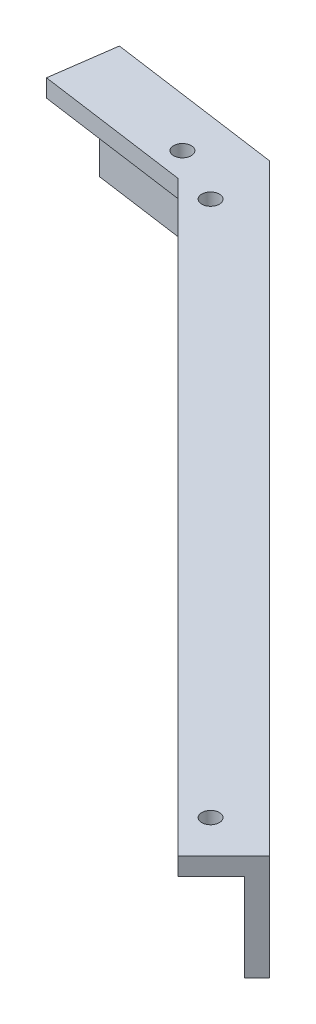
ISO-10303-21;
HEADER;
FILE_DESCRIPTION(('STEP AP214'),'2;1');
FILE_NAME('part.step','',(''),(''),'','','');
FILE_SCHEMA(('AUTOMOTIVE_DESIGN { 1 0 10303 214 1 1 1 1 }'));
ENDSEC;
DATA;
#1=APPLICATION_CONTEXT('core data for automotive mechanical design processes');
#2=APPLICATION_PROTOCOL_DEFINITION('international standard','automotive_design',2000,#1);
#3=PRODUCT_CONTEXT('',#1,'mechanical');
#4=PRODUCT('Part','Part','',(#3));
#5=PRODUCT_RELATED_PRODUCT_CATEGORY('part','',(#4));
#6=PRODUCT_DEFINITION_FORMATION('','',#4);
#7=PRODUCT_DEFINITION_CONTEXT('part definition',#1,'design');
#8=PRODUCT_DEFINITION('design','',#6,#7);
#9=PRODUCT_DEFINITION_SHAPE('','',#8);
#10=(LENGTH_UNIT() NAMED_UNIT(*) SI_UNIT(.MILLI.,.METRE.));
#11=(NAMED_UNIT(*) PLANE_ANGLE_UNIT() SI_UNIT($,.RADIAN.));
#12=(NAMED_UNIT(*) SI_UNIT($,.STERADIAN.) SOLID_ANGLE_UNIT());
#13=UNCERTAINTY_MEASURE_WITH_UNIT(LENGTH_MEASURE(1.E-05),#10,'distance_accuracy_value','');
#14=(GEOMETRIC_REPRESENTATION_CONTEXT(3) GLOBAL_UNCERTAINTY_ASSIGNED_CONTEXT((#13)) GLOBAL_UNIT_ASSIGNED_CONTEXT((#10,
#11,#12)) REPRESENTATION_CONTEXT('',''));
#15=CARTESIAN_POINT('',(0.,0.,0.));
#16=DIRECTION('',(0.,0.,1.));
#17=DIRECTION('',(1.,0.,0.));
#18=AXIS2_PLACEMENT_3D('',#15,#16,#17);
#19=CARTESIAN_POINT('',(60.4436508138957,0.,11.));
#20=DIRECTION('',(-0.707106781186547,0.,0.707106781186548));
#21=DIRECTION('',(0.707106781186548,0.,0.707106781186547));
#22=AXIS2_PLACEMENT_3D('',#19,#20,#21);
#23=PLANE('',#22);
#24=DIRECTION('',(0.707106781186548,0.,0.707106781186547));
#25=VECTOR('',#24,1.);
#26=CARTESIAN_POINT('',(60.4436508138957,3.,11.));
#27=LINE('',#26,#25);
#28=CARTESIAN_POINT('',(59.8286748561863,3.,10.3850240422906));
#29=VERTEX_POINT('',#28);
#30=CARTESIAN_POINT('',(159.752308678997,3.,110.308657865102));
#31=VERTEX_POINT('',#30);
#32=EDGE_CURVE('E197',#29,#31,#27,.T.);
#33=ORIENTED_EDGE('',*,*,#32,.F.);
#34=DIRECTION('',(0.,-1.,0.));
#35=VECTOR('',#34,1.);
#36=CARTESIAN_POINT('',(59.8286748561863,6.,10.3850240422906));
#37=LINE('',#36,#35);
#38=CARTESIAN_POINT('',(59.8286748561863,0.,10.3850240422906));
#39=VERTEX_POINT('',#38);
#40=EDGE_CURVE('E173',#29,#39,#37,.T.);
#41=ORIENTED_EDGE('',*,*,#40,.T.);
#42=DIRECTION('',(0.707106781186548,0.,0.707106781186547));
#43=VECTOR('',#42,1.);
#44=CARTESIAN_POINT('',(60.4436508138957,0.,11.));
#45=LINE('',#44,#43);
#46=CARTESIAN_POINT('',(159.752308678997,0.,110.308657865102));
#47=VERTEX_POINT('',#46);
#48=EDGE_CURVE('E206',#39,#47,#45,.T.);
#49=ORIENTED_EDGE('',*,*,#48,.T.);
#50=DIRECTION('',(0.,1.,0.));
#51=VECTOR('',#50,1.);
#52=CARTESIAN_POINT('',(159.752308678997,0.,110.308657865102));
#53=LINE('',#52,#51);
#54=EDGE_CURVE('E208',#47,#31,#53,.T.);
#55=ORIENTED_EDGE('',*,*,#54,.T.);
#56=EDGE_LOOP('',(#33,#41,#49,#55));
#57=FACE_BOUND('',#56,.T.);
#58=ADVANCED_FACE('F52',(#57),#23,.T.);
#59=CARTESIAN_POINT('',(33.7677613438322,6.,6.74887164822224));
#60=DIRECTION('',(0.138186558052084,0.,-0.990406217253162));
#61=DIRECTION('',(-0.990406217253162,0.,-0.138186558052085));
#62=AXIS2_PLACEMENT_3D('',#59,#60,#61);
#63=PLANE('',#62);
#64=DIRECTION('',(0.990406217253162,0.,0.138186558052085));
#65=VECTOR('',#64,1.);
#66=CARTESIAN_POINT('',(33.7677613438322,3.,6.74887164822224));
#67=LINE('',#66,#65);
#68=CARTESIAN_POINT('',(33.7677613438322,3.,6.74887164822224));
#69=VERTEX_POINT('',#68);
#70=EDGE_CURVE('E165',#69,#29,#67,.T.);
#71=ORIENTED_EDGE('',*,*,#70,.F.);
#72=DIRECTION('',(0.,-1.,0.));
#73=VECTOR('',#72,1.);
#74=CARTESIAN_POINT('',(33.7677613438322,6.,6.74887164822224));
#75=LINE('',#74,#73);
#76=CARTESIAN_POINT('',(33.7677613438322,0.,6.74887164822224));
#77=VERTEX_POINT('',#76);
#78=EDGE_CURVE('E175',#69,#77,#75,.T.);
#79=ORIENTED_EDGE('',*,*,#78,.T.);
#80=DIRECTION('',(-0.990406217253162,0.,-0.138186558052084));
#81=VECTOR('',#80,1.);
#82=CARTESIAN_POINT('',(59.8286748561863,0.,10.3850240422906));
#83=LINE('',#82,#81);
#84=EDGE_CURVE('E170',#39,#77,#83,.T.);
#85=ORIENTED_EDGE('',*,*,#84,.F.);
#86=ORIENTED_EDGE('',*,*,#40,.F.);
#87=EDGE_LOOP('',(#71,#79,#85,#86));
#88=FACE_BOUND('',#87,.T.);
#89=ADVANCED_FACE('F261',(#88),#63,.F.);
#90=CARTESIAN_POINT('',(35.2878134824051,6.,-4.14559674156254));
#91=DIRECTION('',(0.990406217253162,0.,0.138186558052085));
#92=DIRECTION('',(0.138186558052085,0.,-0.990406217253162));
#93=AXIS2_PLACEMENT_3D('',#90,#91,#92);
#94=PLANE('',#93);
#95=DIRECTION('',(-0.138186558052085,0.,0.990406217253162));
#96=VECTOR('',#95,1.);
#97=CARTESIAN_POINT('',(35.2878134824051,3.,-4.14559674156254));
#98=LINE('',#97,#96);
#99=CARTESIAN_POINT('',(35.2878134824051,3.,-4.14559674156254));
#100=VERTEX_POINT('',#99);
#101=EDGE_CURVE('E163',#100,#69,#98,.T.);
#102=ORIENTED_EDGE('',*,*,#101,.F.);
#103=DIRECTION('',(0.,-1.,0.));
#104=VECTOR('',#103,1.);
#105=CARTESIAN_POINT('',(35.2878134824051,6.,-4.14559674156254));
#106=LINE('',#105,#104);
#107=CARTESIAN_POINT('',(35.2878134824051,-15.,-4.14559674156254));
#108=VERTEX_POINT('',#107);
#109=EDGE_CURVE('E178',#100,#108,#106,.T.);
#110=ORIENTED_EDGE('',*,*,#109,.T.);
#111=DIRECTION('',(0.138186558052085,0.,-0.990406217253162));
#112=VECTOR('',#111,1.);
#113=CARTESIAN_POINT('',(34.0466043686968,-15.,4.75035696375144));
#114=LINE('',#113,#112);
#115=CARTESIAN_POINT('',(34.8732538082489,-15.,-1.17437808980306));
#116=VERTEX_POINT('',#115);
#117=EDGE_CURVE('E150',#116,#108,#114,.T.);
#118=ORIENTED_EDGE('',*,*,#117,.F.);
#119=DIRECTION('',(0.,1.,0.));
#120=VECTOR('',#119,1.);
#121=CARTESIAN_POINT('',(34.8732538082489,-15.,-1.17437808980306));
#122=LINE('',#121,#120);
#123=CARTESIAN_POINT('',(34.8732538082489,0.,-1.17437808980306));
#124=VERTEX_POINT('',#123);
#125=EDGE_CURVE('E146',#116,#124,#122,.T.);
#126=ORIENTED_EDGE('',*,*,#125,.T.);
#127=DIRECTION('',(-0.138186558052085,0.,0.990406217253162));
#128=VECTOR('',#127,1.);
#129=CARTESIAN_POINT('',(35.2878134824051,0.,-4.14559674156254));
#130=LINE('',#129,#128);
#131=EDGE_CURVE('E168',#124,#77,#130,.T.);
#132=ORIENTED_EDGE('',*,*,#131,.T.);
#133=ORIENTED_EDGE('',*,*,#78,.F.);
#134=EDGE_LOOP('',(#102,#110,#118,#126,#132,#133));
#135=FACE_BOUND('',#134,.T.);
#136=ADVANCED_FACE('F239',(#135),#94,.F.);
#137=CARTESIAN_POINT('',(65.,6.,0.));
#138=DIRECTION('',(-0.138186558052085,0.,0.990406217253162));
#139=DIRECTION('',(0.990406217253162,0.,0.138186558052085));
#140=AXIS2_PLACEMENT_3D('',#137,#138,#139);
#141=PLANE('',#140);
#142=CARTESIAN_POINT('',(57.0767502619747,-4.1,-1.10549246441668));
#143=DIRECTION('',(0.138186558052085,0.,-0.990406217253162));
#144=DIRECTION('',(-0.990406217253162,0.,-0.138186558052085));
#145=AXIS2_PLACEMENT_3D('',#142,#143,#144);
#146=CIRCLE('',#145,1.50000000000001);
#147=CARTESIAN_POINT('',(55.591140936095,-4.1,-1.31277230149481));
#148=VERTEX_POINT('',#147);
#149=EDGE_CURVE('E227',#148,#148,#146,.T.);
#150=ORIENTED_EDGE('',*,*,#149,.F.);
#151=EDGE_LOOP('',(#150));
#152=FACE_BOUND('',#151,.T.);
#153=DIRECTION('',(-0.990406217253162,0.,-0.138186558052085));
#154=VECTOR('',#153,1.);
#155=CARTESIAN_POINT('',(65.,3.,0.));
#156=LINE('',#155,#154);
#157=CARTESIAN_POINT('',(65.,3.,0.));
#158=VERTEX_POINT('',#157);
#159=EDGE_CURVE('E145',#158,#100,#156,.T.);
#160=ORIENTED_EDGE('',*,*,#159,.F.);
#161=DIRECTION('',(0.,-1.,0.));
#162=VECTOR('',#161,1.);
#163=CARTESIAN_POINT('',(65.,3.,0.));
#164=LINE('',#163,#162);
#165=CARTESIAN_POINT('',(65.,-15.,0.));
#166=VERTEX_POINT('',#165);
#167=EDGE_CURVE('E61',#158,#166,#164,.T.);
#168=ORIENTED_EDGE('',*,*,#167,.T.);
#169=DIRECTION('',(0.990406217253162,0.,0.138186558052085));
#170=VECTOR('',#169,1.);
#171=CARTESIAN_POINT('',(1.24120911370834,-15.,-8.89595370531399));
#172=LINE('',#171,#170);
#173=EDGE_CURVE('E153',#108,#166,#172,.T.);
#174=ORIENTED_EDGE('',*,*,#173,.F.);
#175=ORIENTED_EDGE('',*,*,#109,.F.);
#176=EDGE_LOOP('',(#160,#168,#174,#175));
#177=FACE_BOUND('',#176,.T.);
#178=ADVANCED_FACE('F235',(#152,#177),#141,.F.);
#179=CARTESIAN_POINT('',(0.,3.,0.));
#180=DIRECTION('',(0.,-1.,0.));
#181=DIRECTION('',(0.,0.,-1.));
#182=AXIS2_PLACEMENT_3D('',#179,#180,#181);
#183=PLANE('',#182);
#184=CARTESIAN_POINT('',(56.0956256998049,3.,5.92639167808077));
#185=DIRECTION('',(0.,-1.,0.));
#186=DIRECTION('',(0.,0.,-1.));
#187=AXIS2_PLACEMENT_3D('',#184,#185,#186);
#188=CIRCLE('',#187,1.5);
#189=CARTESIAN_POINT('',(56.0956256998049,3.,4.42639167808077));
#190=VERTEX_POINT('',#189);
#191=EDGE_CURVE('E155',#190,#190,#188,.T.);
#192=ORIENTED_EDGE('',*,*,#191,.T.);
#193=EDGE_LOOP('',(#192));
#194=FACE_BOUND('',#193,.T.);
#195=CARTESIAN_POINT('',(156.853170876133,3.,101.894087168981));
#196=DIRECTION('',(0.,1.,0.));
#197=DIRECTION('',(0.,0.,1.));
#198=AXIS2_PLACEMENT_3D('',#195,#196,#197);
#199=CIRCLE('',#198,1.50000000000002);
#200=CARTESIAN_POINT('',(156.853170876133,3.,103.394087168982));
#201=VERTEX_POINT('',#200);
#202=EDGE_CURVE('E193',#201,#201,#199,.T.);
#203=ORIENTED_EDGE('',*,*,#202,.F.);
#204=EDGE_LOOP('',(#203));
#205=FACE_BOUND('',#204,.T.);
#206=DIRECTION('',(-0.707106781186548,0.,-0.707106781186547));
#207=VECTOR('',#206,1.);
#208=CARTESIAN_POINT('',(65.,3.,0.));
#209=LINE('',#208,#207);
#210=CARTESIAN_POINT('',(167.530483272049,3.,102.530483272049));
#211=VERTEX_POINT('',#210);
#212=EDGE_CURVE('E214',#211,#158,#209,.T.);
#213=ORIENTED_EDGE('',*,*,#212,.T.);
#214=ORIENTED_EDGE('',*,*,#159,.T.);
#215=ORIENTED_EDGE('',*,*,#101,.T.);
#216=ORIENTED_EDGE('',*,*,#70,.T.);
#217=ORIENTED_EDGE('',*,*,#32,.T.);
#218=DIRECTION('',(0.707106781186548,0.,-0.707106781186547));
#219=VECTOR('',#218,1.);
#220=CARTESIAN_POINT('',(167.530483272049,3.,102.530483272049));
#221=LINE('',#220,#219);
#222=EDGE_CURVE('E77',#31,#211,#221,.T.);
#223=ORIENTED_EDGE('',*,*,#222,.T.);
#224=EDGE_LOOP('',(#213,#214,#215,#216,#217,#223));
#225=FACE_BOUND('',#224,.T.);
#226=CARTESIAN_POINT('',(65.6363961030679,3.,10.6773123959169));
#227=DIRECTION('',(0.,1.,0.));
#228=DIRECTION('',(0.,0.,1.));
#229=AXIS2_PLACEMENT_3D('',#226,#227,#228);
#230=CIRCLE('',#229,1.5);
#231=CARTESIAN_POINT('',(65.6363961030679,3.,12.1773123959168));
#232=VERTEX_POINT('',#231);
#233=EDGE_CURVE('E198',#232,#232,#230,.T.);
#234=ORIENTED_EDGE('',*,*,#233,.F.);
#235=EDGE_LOOP('',(#234));
#236=FACE_BOUND('',#235,.T.);
#237=ADVANCED_FACE('F238',(#194,#205,#225,#236),#183,.F.);
#238=CARTESIAN_POINT('',(0.,0.,0.));
#239=DIRECTION('',(0.,-1.,0.));
#240=DIRECTION('',(0.,0.,-1.));
#241=AXIS2_PLACEMENT_3D('',#238,#239,#240);
#242=PLANE('',#241);
#243=CARTESIAN_POINT('',(56.0956256998049,0.,5.92639167808077));
#244=DIRECTION('',(0.,-1.,0.));
#245=DIRECTION('',(0.,0.,-1.));
#246=AXIS2_PLACEMENT_3D('',#243,#244,#245);
#247=CIRCLE('',#246,1.5);
#248=CARTESIAN_POINT('',(56.0956256998049,0.,4.42639167808077));
#249=VERTEX_POINT('',#248);
#250=EDGE_CURVE('E221',#249,#249,#247,.T.);
#251=ORIENTED_EDGE('',*,*,#250,.F.);
#252=EDGE_LOOP('',(#251));
#253=FACE_BOUND('',#252,.T.);
#254=DIRECTION('',(0.990406217253162,0.,0.138186558052085));
#255=VECTOR('',#254,1.);
#256=CARTESIAN_POINT('',(0.826649439552089,0.,-5.9247350535545));
#257=LINE('',#256,#255);
#258=CARTESIAN_POINT('',(63.5896385971419,0.,2.8322792842611));
#259=VERTEX_POINT('',#258);
#260=EDGE_CURVE('E151',#124,#259,#257,.T.);
#261=ORIENTED_EDGE('',*,*,#260,.T.);
#262=DIRECTION('',(-0.707106781186547,0.,-0.707106781186548));
#263=VECTOR('',#262,1.);
#264=CARTESIAN_POINT('',(63.7573593128808,0.,3.));
#265=LINE('',#264,#263);
#266=CARTESIAN_POINT('',(165.40916292849,0.,104.651803615609));
#267=VERTEX_POINT('',#266);
#268=EDGE_CURVE('E69',#267,#259,#265,.T.);
#269=ORIENTED_EDGE('',*,*,#268,.F.);
#270=DIRECTION('',(0.707106781186548,0.,-0.707106781186547));
#271=VECTOR('',#270,1.);
#272=CARTESIAN_POINT('',(167.530483272049,0.,102.530483272049));
#273=LINE('',#272,#271);
#274=EDGE_CURVE('E212',#47,#267,#273,.T.);
#275=ORIENTED_EDGE('',*,*,#274,.F.);
#276=ORIENTED_EDGE('',*,*,#48,.F.);
#277=ORIENTED_EDGE('',*,*,#84,.T.);
#278=ORIENTED_EDGE('',*,*,#131,.F.);
#279=EDGE_LOOP('',(#261,#269,#275,#276,#277,#278));
#280=FACE_BOUND('',#279,.T.);
#281=CARTESIAN_POINT('',(65.6363961030679,0.,10.6773123959169));
#282=DIRECTION('',(0.,1.,0.));
#283=DIRECTION('',(0.,0.,1.));
#284=AXIS2_PLACEMENT_3D('',#281,#282,#283);
#285=CIRCLE('',#284,1.5);
#286=CARTESIAN_POINT('',(65.6363961030679,0.,12.1773123959168));
#287=VERTEX_POINT('',#286);
#288=EDGE_CURVE('E194',#287,#287,#285,.T.);
#289=ORIENTED_EDGE('',*,*,#288,.T.);
#290=EDGE_LOOP('',(#289));
#291=FACE_BOUND('',#290,.T.);
#292=CARTESIAN_POINT('',(156.853170876133,0.,101.894087168981));
#293=DIRECTION('',(0.,1.,0.));
#294=DIRECTION('',(0.,0.,1.));
#295=AXIS2_PLACEMENT_3D('',#292,#293,#294);
#296=CIRCLE('',#295,1.50000000000002);
#297=CARTESIAN_POINT('',(156.853170876133,0.,103.394087168982));
#298=VERTEX_POINT('',#297);
#299=EDGE_CURVE('E201',#298,#298,#296,.T.);
#300=ORIENTED_EDGE('',*,*,#299,.T.);
#301=EDGE_LOOP('',(#300));
#302=FACE_BOUND('',#301,.T.);
#303=ADVANCED_FACE('F253',(#253,#280,#291,#302),#242,.T.);
#304=CARTESIAN_POINT('',(167.530483272049,3.,102.530483272049));
#305=DIRECTION('',(-0.707106781186547,0.,-0.707106781186548));
#306=DIRECTION('',(-0.707106781186548,0.,0.707106781186547));
#307=AXIS2_PLACEMENT_3D('',#304,#305,#306);
#308=PLANE('',#307);
#309=ORIENTED_EDGE('',*,*,#274,.T.);
#310=DIRECTION('',(0.,1.,0.));
#311=VECTOR('',#310,1.);
#312=CARTESIAN_POINT('',(165.40916292849,-15.,104.651803615609));
#313=LINE('',#312,#311);
#314=CARTESIAN_POINT('',(165.40916292849,-15.,104.651803615609));
#315=VERTEX_POINT('',#314);
#316=EDGE_CURVE('E138',#315,#267,#313,.T.);
#317=ORIENTED_EDGE('',*,*,#316,.F.);
#318=DIRECTION('',(-0.707106781186545,0.,0.70710678118655));
#319=VECTOR('',#318,1.);
#320=CARTESIAN_POINT('',(165.40916292849,-15.,104.651803615609));
#321=LINE('',#320,#319);
#322=CARTESIAN_POINT('',(167.530483272049,-15.,102.530483272049));
#323=VERTEX_POINT('',#322);
#324=EDGE_CURVE('E134',#323,#315,#321,.T.);
#325=ORIENTED_EDGE('',*,*,#324,.F.);
#326=DIRECTION('',(0.,-1.,0.));
#327=VECTOR('',#326,1.);
#328=CARTESIAN_POINT('',(167.530483272049,3.,102.530483272049));
#329=LINE('',#328,#327);
#330=EDGE_CURVE('E13',#211,#323,#329,.T.);
#331=ORIENTED_EDGE('',*,*,#330,.F.);
#332=ORIENTED_EDGE('',*,*,#222,.F.);
#333=ORIENTED_EDGE('',*,*,#54,.F.);
#334=EDGE_LOOP('',(#309,#317,#325,#331,#332,#333));
#335=FACE_BOUND('',#334,.T.);
#336=ADVANCED_FACE('F54',(#335),#308,.F.);
#337=CARTESIAN_POINT('',(65.,3.,0.));
#338=DIRECTION('',(-0.707106781186547,0.,0.707106781186548));
#339=DIRECTION('',(0.707106781186548,0.,0.707106781186547));
#340=AXIS2_PLACEMENT_3D('',#337,#338,#339);
#341=PLANE('',#340);
#342=CARTESIAN_POINT('',(161.873629022557,-7.5,96.873629022557));
#343=DIRECTION('',(0.707106781186548,0.,-0.707106781186548));
#344=DIRECTION('',(-0.707106781186548,0.,-0.707106781186548));
#345=AXIS2_PLACEMENT_3D('',#342,#343,#344);
#346=CIRCLE('',#345,1.50000000000003);
#347=CARTESIAN_POINT('',(160.812968850777,-7.5,95.8129688507771));
#348=VERTEX_POINT('',#347);
#349=EDGE_CURVE('E181',#348,#348,#346,.T.);
#350=ORIENTED_EDGE('',*,*,#349,.F.);
#351=EDGE_LOOP('',(#350));
#352=FACE_BOUND('',#351,.T.);
#353=CARTESIAN_POINT('',(70.6568542494924,-7.5,5.65685424949237));
#354=DIRECTION('',(0.707106781186548,0.,-0.707106781186548));
#355=DIRECTION('',(-0.707106781186548,0.,-0.707106781186548));
#356=AXIS2_PLACEMENT_3D('',#353,#354,#355);
#357=CIRCLE('',#356,1.5);
#358=CARTESIAN_POINT('',(69.5961940777126,-7.5,4.59619407771254));
#359=VERTEX_POINT('',#358);
#360=EDGE_CURVE('E180',#359,#359,#357,.T.);
#361=ORIENTED_EDGE('',*,*,#360,.F.);
#362=EDGE_LOOP('',(#361));
#363=FACE_BOUND('',#362,.T.);
#364=ORIENTED_EDGE('',*,*,#330,.T.);
#365=DIRECTION('',(0.707106781186548,0.,0.707106781186547));
#366=VECTOR('',#365,1.);
#367=CARTESIAN_POINT('',(167.530483272049,-15.,102.530483272049));
#368=LINE('',#367,#366);
#369=EDGE_CURVE('E187',#166,#323,#368,.T.);
#370=ORIENTED_EDGE('',*,*,#369,.F.);
#371=ORIENTED_EDGE('',*,*,#167,.F.);
#372=ORIENTED_EDGE('',*,*,#212,.F.);
#373=EDGE_LOOP('',(#364,#370,#371,#372));
#374=FACE_BOUND('',#373,.T.);
#375=ADVANCED_FACE('F249',(#352,#363,#374),#341,.F.);
#376=CARTESIAN_POINT('',(156.853170876133,0.,101.894087168981));
#377=DIRECTION('',(0.,1.,0.));
#378=DIRECTION('',(0.,0.,1.));
#379=AXIS2_PLACEMENT_3D('',#376,#377,#378);
#380=CYLINDRICAL_SURFACE('',#379,1.50000000000002);
#381=ORIENTED_EDGE('',*,*,#299,.F.);
#382=EDGE_LOOP('',(#381));
#383=FACE_BOUND('',#382,.T.);
#384=ORIENTED_EDGE('',*,*,#202,.T.);
#385=EDGE_LOOP('',(#384));
#386=FACE_BOUND('',#385,.T.);
#387=ADVANCED_FACE('F274',(#383,#386),#380,.F.);
#388=CARTESIAN_POINT('',(65.6363961030679,0.,10.6773123959169));
#389=DIRECTION('',(0.,1.,0.));
#390=DIRECTION('',(0.,0.,1.));
#391=AXIS2_PLACEMENT_3D('',#388,#389,#390);
#392=CYLINDRICAL_SURFACE('',#391,1.5);
#393=ORIENTED_EDGE('',*,*,#288,.F.);
#394=EDGE_LOOP('',(#393));
#395=FACE_BOUND('',#394,.T.);
#396=ORIENTED_EDGE('',*,*,#233,.T.);
#397=EDGE_LOOP('',(#396));
#398=FACE_BOUND('',#397,.T.);
#399=ADVANCED_FACE('F288',(#395,#398),#392,.F.);
#400=CARTESIAN_POINT('',(63.7573593128808,-15.,3.));
#401=DIRECTION('',(0.707106781186548,0.,-0.707106781186547));
#402=DIRECTION('',(-0.707106781186547,0.,-0.707106781186548));
#403=AXIS2_PLACEMENT_3D('',#400,#401,#402);
#404=PLANE('',#403);
#405=CARTESIAN_POINT('',(159.752308678997,-7.5,98.9949493661166));
#406=DIRECTION('',(0.707106781186548,0.,-0.707106781186547));
#407=DIRECTION('',(-0.707106781186547,0.,-0.707106781186548));
#408=AXIS2_PLACEMENT_3D('',#405,#406,#407);
#409=CIRCLE('',#408,1.50000000000003);
#410=CARTESIAN_POINT('',(158.691648507218,-7.5,97.9342891943368));
#411=VERTEX_POINT('',#410);
#412=EDGE_CURVE('E191',#411,#411,#409,.T.);
#413=ORIENTED_EDGE('',*,*,#412,.T.);
#414=EDGE_LOOP('',(#413));
#415=FACE_BOUND('',#414,.T.);
#416=CARTESIAN_POINT('',(68.5355339059328,-7.5,7.77817459305199));
#417=DIRECTION('',(0.707106781186548,0.,-0.707106781186547));
#418=DIRECTION('',(-0.707106781186547,0.,-0.707106781186548));
#419=AXIS2_PLACEMENT_3D('',#416,#417,#418);
#420=CIRCLE('',#419,1.5);
#421=CARTESIAN_POINT('',(67.474873734153,-7.5,6.71751442127216));
#422=VERTEX_POINT('',#421);
#423=EDGE_CURVE('E184',#422,#422,#420,.T.);
#424=ORIENTED_EDGE('',*,*,#423,.T.);
#425=EDGE_LOOP('',(#424));
#426=FACE_BOUND('',#425,.T.);
#427=ORIENTED_EDGE('',*,*,#268,.T.);
#428=DIRECTION('',(0.,1.,0.));
#429=VECTOR('',#428,1.);
#430=CARTESIAN_POINT('',(63.5896385971419,-15.,2.8322792842611));
#431=LINE('',#430,#429);
#432=CARTESIAN_POINT('',(63.5896385971419,-15.,2.8322792842611));
#433=VERTEX_POINT('',#432);
#434=EDGE_CURVE('E141',#433,#259,#431,.T.);
#435=ORIENTED_EDGE('',*,*,#434,.F.);
#436=DIRECTION('',(-0.707106781186547,0.,-0.707106781186548));
#437=VECTOR('',#436,1.);
#438=CARTESIAN_POINT('',(63.7573593128808,-15.,3.));
#439=LINE('',#438,#437);
#440=EDGE_CURVE('E125',#315,#433,#439,.T.);
#441=ORIENTED_EDGE('',*,*,#440,.F.);
#442=ORIENTED_EDGE('',*,*,#316,.T.);
#443=EDGE_LOOP('',(#427,#435,#441,#442));
#444=FACE_BOUND('',#443,.T.);
#445=ADVANCED_FACE('F142',(#415,#426,#444),#404,.F.);
#446=CARTESIAN_POINT('',(0.,-15.,0.));
#447=DIRECTION('',(0.,1.,0.));
#448=DIRECTION('',(0.,0.,1.));
#449=AXIS2_PLACEMENT_3D('',#446,#447,#448);
#450=PLANE('',#449);
#451=ORIENTED_EDGE('',*,*,#173,.T.);
#452=ORIENTED_EDGE('',*,*,#369,.T.);
#453=ORIENTED_EDGE('',*,*,#324,.T.);
#454=ORIENTED_EDGE('',*,*,#440,.T.);
#455=DIRECTION('',(0.990406217253162,0.,0.138186558052085));
#456=VECTOR('',#455,1.);
#457=CARTESIAN_POINT('',(0.826649439552089,-15.,-5.9247350535545));
#458=LINE('',#457,#456);
#459=EDGE_CURVE('E131',#116,#433,#458,.T.);
#460=ORIENTED_EDGE('',*,*,#459,.F.);
#461=ORIENTED_EDGE('',*,*,#117,.T.);
#462=EDGE_LOOP('',(#451,#452,#453,#454,#460,#461));
#463=FACE_BOUND('',#462,.T.);
#464=ADVANCED_FACE('F128',(#463),#450,.F.);
#465=CARTESIAN_POINT('',(60.0502525316942,-7.5,16.2634559672906));
#466=DIRECTION('',(0.707106781186547,0.,-0.707106781186547));
#467=DIRECTION('',(-0.707106781186548,0.,-0.707106781186548));
#468=AXIS2_PLACEMENT_3D('',#465,#466,#467);
#469=CYLINDRICAL_SURFACE('',#468,1.5);
#470=ORIENTED_EDGE('',*,*,#360,.T.);
#471=EDGE_LOOP('',(#470));
#472=FACE_BOUND('',#471,.T.);
#473=ORIENTED_EDGE('',*,*,#423,.F.);
#474=EDGE_LOOP('',(#473));
#475=FACE_BOUND('',#474,.T.);
#476=ADVANCED_FACE('F295',(#472,#475),#469,.F.);
#477=CARTESIAN_POINT('',(151.267027304759,-7.5,107.480230740355));
#478=DIRECTION('',(0.707106781186547,0.,-0.707106781186547));
#479=DIRECTION('',(-0.707106781186548,0.,-0.707106781186548));
#480=AXIS2_PLACEMENT_3D('',#477,#478,#479);
#481=CYLINDRICAL_SURFACE('',#480,1.50000000000003);
#482=ORIENTED_EDGE('',*,*,#349,.T.);
#483=EDGE_LOOP('',(#482));
#484=FACE_BOUND('',#483,.T.);
#485=ORIENTED_EDGE('',*,*,#412,.F.);
#486=EDGE_LOOP('',(#485));
#487=FACE_BOUND('',#486,.T.);
#488=ADVANCED_FACE('F298',(#484,#487),#481,.F.);
#489=CARTESIAN_POINT('',(0.826649439552089,-15.,-5.9247350535545));
#490=DIRECTION('',(-0.138186558052085,0.,0.990406217253162));
#491=DIRECTION('',(0.990406217253162,0.,0.138186558052085));
#492=AXIS2_PLACEMENT_3D('',#489,#490,#491);
#493=PLANE('',#492);
#494=CARTESIAN_POINT('',(56.6621905878185,-4.1,1.86572618734281));
#495=DIRECTION('',(-0.138186558052085,0.,0.990406217253162));
#496=DIRECTION('',(0.990406217253162,0.,0.138186558052085));
#497=AXIS2_PLACEMENT_3D('',#494,#495,#496);
#498=CIRCLE('',#497,1.50000000000001);
#499=CARTESIAN_POINT('',(58.1477999136982,-4.1,2.07300602442094));
#500=VERTEX_POINT('',#499);
#501=EDGE_CURVE('E56',#500,#500,#498,.T.);
#502=ORIENTED_EDGE('',*,*,#501,.F.);
#503=EDGE_LOOP('',(#502));
#504=FACE_BOUND('',#503,.T.);
#505=ORIENTED_EDGE('',*,*,#260,.F.);
#506=ORIENTED_EDGE('',*,*,#125,.F.);
#507=ORIENTED_EDGE('',*,*,#459,.T.);
#508=ORIENTED_EDGE('',*,*,#434,.T.);
#509=EDGE_LOOP('',(#505,#506,#507,#508));
#510=FACE_BOUND('',#509,.T.);
#511=ADVANCED_FACE('F148',(#504,#510),#493,.T.);
#512=CARTESIAN_POINT('',(56.0956256998049,15.,5.92639167808077));
#513=DIRECTION('',(0.,-1.,0.));
#514=DIRECTION('',(0.,0.,-1.));
#515=AXIS2_PLACEMENT_3D('',#512,#513,#514);
#516=CYLINDRICAL_SURFACE('',#515,1.5);
#517=CARTESIAN_POINT('',(56.0956256998049,0.,4.42639167808077));
#518=CARTESIAN_POINT('',(56.0956256998049,0.0312500000000018,4.42639167808077));
#519=CARTESIAN_POINT('',(56.0956256998049,0.0625000000000018,4.42639167808077));
#520=CARTESIAN_POINT('',(56.0956256998049,0.125000000000002,4.42639167808077));
#521=CARTESIAN_POINT('',(56.0956256998049,0.156250000000002,4.42639167808077));
#522=CARTESIAN_POINT('',(56.0956256998049,0.218750000000002,4.42639167808077));
#523=CARTESIAN_POINT('',(56.0956256998049,0.250000000000002,4.42639167808077));
#524=CARTESIAN_POINT('',(56.0956256998049,0.312500000000002,4.42639167808077));
#525=CARTESIAN_POINT('',(56.0956256998049,0.343750000000002,4.42639167808077));
#526=CARTESIAN_POINT('',(56.0956256998049,0.406250000000002,4.42639167808077));
#527=CARTESIAN_POINT('',(56.0956256998049,0.437500000000002,4.42639167808077));
#528=CARTESIAN_POINT('',(56.0956256998049,0.500000000000002,4.42639167808077));
#529=CARTESIAN_POINT('',(56.0956256998049,0.531250000000002,4.42639167808077));
#530=CARTESIAN_POINT('',(56.0956256998049,0.593750000000002,4.42639167808077));
#531=CARTESIAN_POINT('',(56.0956256998049,0.625000000000002,4.42639167808077));
#532=CARTESIAN_POINT('',(56.0956256998049,0.687500000000002,4.42639167808077));
#533=CARTESIAN_POINT('',(56.0956256998049,0.718750000000002,4.42639167808077));
#534=CARTESIAN_POINT('',(56.0956256998049,0.781250000000002,4.42639167808077));
#535=CARTESIAN_POINT('',(56.0956256998049,0.812500000000001,4.42639167808077));
#536=CARTESIAN_POINT('',(56.0956256998049,0.875000000000001,4.42639167808077));
#537=CARTESIAN_POINT('',(56.0956256998049,0.906250000000001,4.42639167808077));
#538=CARTESIAN_POINT('',(56.0956256998049,0.968750000000001,4.42639167808077));
#539=CARTESIAN_POINT('',(56.0956256998049,1.,4.42639167808077));
#540=CARTESIAN_POINT('',(56.0956256998049,1.0625,4.42639167808077));
#541=CARTESIAN_POINT('',(56.0956256998049,1.09375,4.42639167808077));
#542=CARTESIAN_POINT('',(56.0956256998049,1.15625,4.42639167808077));
#543=CARTESIAN_POINT('',(56.0956256998049,1.1875,4.42639167808077));
#544=CARTESIAN_POINT('',(56.0956256998049,1.25,4.42639167808077));
#545=CARTESIAN_POINT('',(56.0956256998049,1.28125,4.42639167808077));
#546=CARTESIAN_POINT('',(56.0956256998049,1.34375,4.42639167808077));
#547=CARTESIAN_POINT('',(56.0956256998049,1.375,4.42639167808077));
#548=CARTESIAN_POINT('',(56.0956256998049,1.4375,4.42639167808077));
#549=CARTESIAN_POINT('',(56.0956256998049,1.46875,4.42639167808077));
#550=CARTESIAN_POINT('',(56.0956256998049,1.53125,4.42639167808077));
#551=CARTESIAN_POINT('',(56.0956256998049,1.5625,4.42639167808077));
#552=CARTESIAN_POINT('',(56.0956256998049,1.625,4.42639167808077));
#553=CARTESIAN_POINT('',(56.0956256998049,1.65625,4.42639167808077));
#554=CARTESIAN_POINT('',(56.0956256998049,1.71875,4.42639167808077));
#555=CARTESIAN_POINT('',(56.0956256998049,1.75,4.42639167808077));
#556=CARTESIAN_POINT('',(56.0956256998049,1.8125,4.42639167808077));
#557=CARTESIAN_POINT('',(56.0956256998049,1.84375,4.42639167808077));
#558=CARTESIAN_POINT('',(56.0956256998049,1.90625,4.42639167808077));
#559=CARTESIAN_POINT('',(56.0956256998049,1.9375,4.42639167808077));
#560=CARTESIAN_POINT('',(56.0956256998049,2.,4.42639167808077));
#561=CARTESIAN_POINT('',(56.0956256998049,2.03125,4.42639167808077));
#562=CARTESIAN_POINT('',(56.0956256998049,2.09375,4.42639167808077));
#563=CARTESIAN_POINT('',(56.0956256998049,2.125,4.42639167808077));
#564=CARTESIAN_POINT('',(56.0956256998049,2.1875,4.42639167808077));
#565=CARTESIAN_POINT('',(56.0956256998049,2.21875,4.42639167808077));
#566=CARTESIAN_POINT('',(56.0956256998049,2.28125,4.42639167808077));
#567=CARTESIAN_POINT('',(56.0956256998049,2.3125,4.42639167808077));
#568=CARTESIAN_POINT('',(56.0956256998049,2.375,4.42639167808077));
#569=CARTESIAN_POINT('',(56.0956256998049,2.40625,4.42639167808077));
#570=CARTESIAN_POINT('',(56.0956256998049,2.46875,4.42639167808077));
#571=CARTESIAN_POINT('',(56.0956256998049,2.5,4.42639167808077));
#572=CARTESIAN_POINT('',(56.0956256998049,2.5625,4.42639167808077));
#573=CARTESIAN_POINT('',(56.0956256998049,2.59375,4.42639167808077));
#574=CARTESIAN_POINT('',(56.0956256998049,2.65625,4.42639167808077));
#575=CARTESIAN_POINT('',(56.0956256998049,2.6875,4.42639167808077));
#576=CARTESIAN_POINT('',(56.0956256998049,2.75,4.42639167808077));
#577=CARTESIAN_POINT('',(56.0956256998049,2.78125,4.42639167808077));
#578=CARTESIAN_POINT('',(56.0956256998049,2.84375,4.42639167808077));
#579=CARTESIAN_POINT('',(56.0956256998049,2.875,4.42639167808077));
#580=CARTESIAN_POINT('',(56.0956256998049,2.9375,4.42639167808077));
#581=CARTESIAN_POINT('',(56.0956256998049,2.96875,4.42639167808077));
#582=CARTESIAN_POINT('',(56.0956256998049,3.,4.42639167808077));
#583=B_SPLINE_CURVE_WITH_KNOTS('',3,(#517,#518,#519,#520,#521,#522,#523,#524,#525,#526,#527,
#528,#529,#530,#531,#532,#533,#534,#535,#536,#537,#538,#539,#540,#541,#542,#543,#544,#545,#546,
#547,#548,#549,#550,#551,#552,#553,#554,#555,#556,#557,#558,#559,#560,#561,#562,#563,#564,#565,
#566,#567,#568,#569,#570,#571,#572,#573,#574,#575,#576,#577,#578,#579,#580,#581,#582),
.UNSPECIFIED.,.F.,.F.,(4,2,2,2,2,2,2,2,2,2,2,2,2,2,2,2,2,2,2,2,2,2,2,2,2,2,2,2,2,2,2,2,4),(0.,
0.0937500000000001,0.1875,0.28125,0.375,0.46875,0.5625,0.656250000000001,0.750000000000001,
0.843749999999999,0.937499999999999,1.03125,1.125,1.21875,1.3125,1.40625,1.5,1.59375,1.6875,
1.78125,1.875,1.96875,2.0625,2.15625,2.25,2.34375,2.4375,2.53125,2.625,2.71875,2.8125,2.90625,
3.),.UNSPECIFIED.);
#584=EDGE_CURVE('BSEAM317',#249,#190,#583,.T.);
#585=ORIENTED_EDGE('',*,*,#250,.T.);
#586=ORIENTED_EDGE('',*,*,#191,.F.);
#587=ORIENTED_EDGE('',*,*,#584,.T.);
#588=ORIENTED_EDGE('',*,*,#584,.F.);
#589=EDGE_LOOP('',(#585,#587,#586,#588));
#590=FACE_BOUND('',#589,.T.);
#591=ADVANCED_FACE('F317',(#590),#516,.F.);
#592=CARTESIAN_POINT('',(52.9311535204122,-4.1,28.6066940531782));
#593=DIRECTION('',(0.138186558052085,0.,-0.990406217253162));
#594=DIRECTION('',(-0.990406217253162,0.,-0.138186558052085));
#595=AXIS2_PLACEMENT_3D('',#592,#593,#594);
#596=CYLINDRICAL_SURFACE('',#595,1.50000000000001);
#597=ORIENTED_EDGE('',*,*,#501,.T.);
#598=EDGE_LOOP('',(#597));
#599=FACE_BOUND('',#598,.T.);
#600=ORIENTED_EDGE('',*,*,#149,.T.);
#601=EDGE_LOOP('',(#600));
#602=FACE_BOUND('',#601,.T.);
#603=ADVANCED_FACE('F233',(#599,#602),#596,.F.);
#604=CLOSED_SHELL('',(#58,#89,#136,#178,#237,#303,#336,#375,#387,#399,#445,#464,#476,#488,#511,
#591,#603));
#605=MANIFOLD_SOLID_BREP('B2',#604);
#606=ADVANCED_BREP_SHAPE_REPRESENTATION('',(#18,#605),#14);
#607=SHAPE_DEFINITION_REPRESENTATION(#9,#606);
ENDSEC;
END-ISO-10303-21;
